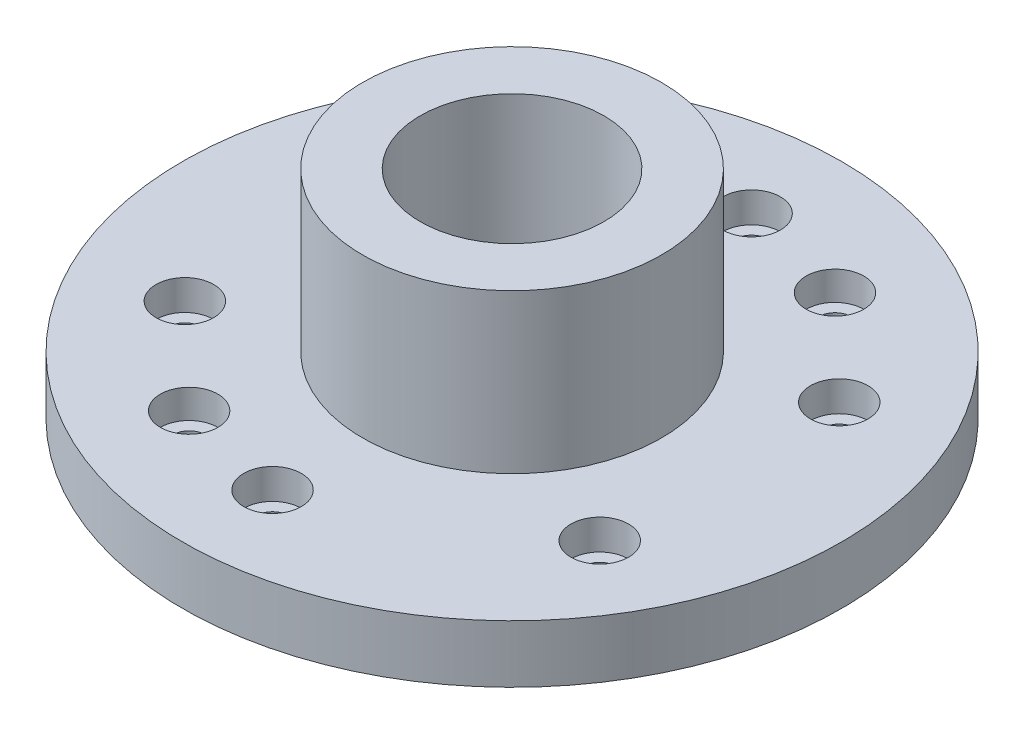
ISO-10303-21;
HEADER;
FILE_DESCRIPTION(('STEP AP214'),'2;1');
FILE_NAME('part.step','',(''),(''),'','','');
FILE_SCHEMA(('AUTOMOTIVE_DESIGN { 1 0 10303 214 1 1 1 1 }'));
ENDSEC;
DATA;
#1=APPLICATION_CONTEXT('core data for automotive mechanical design processes');
#2=APPLICATION_PROTOCOL_DEFINITION('international standard','automotive_design',2000,#1);
#3=PRODUCT_CONTEXT('',#1,'mechanical');
#4=PRODUCT('Part','Part','',(#3));
#5=PRODUCT_RELATED_PRODUCT_CATEGORY('part','',(#4));
#6=PRODUCT_DEFINITION_FORMATION('','',#4);
#7=PRODUCT_DEFINITION_CONTEXT('part definition',#1,'design');
#8=PRODUCT_DEFINITION('design','',#6,#7);
#9=PRODUCT_DEFINITION_SHAPE('','',#8);
#10=(LENGTH_UNIT() NAMED_UNIT(*) SI_UNIT(.MILLI.,.METRE.));
#11=(NAMED_UNIT(*) PLANE_ANGLE_UNIT() SI_UNIT($,.RADIAN.));
#12=(NAMED_UNIT(*) SI_UNIT($,.STERADIAN.) SOLID_ANGLE_UNIT());
#13=UNCERTAINTY_MEASURE_WITH_UNIT(LENGTH_MEASURE(1.E-05),#10,'distance_accuracy_value','');
#14=(GEOMETRIC_REPRESENTATION_CONTEXT(3) GLOBAL_UNCERTAINTY_ASSIGNED_CONTEXT((#13)) GLOBAL_UNIT_ASSIGNED_CONTEXT((#10,
#11,#12)) REPRESENTATION_CONTEXT('',''));
#15=CARTESIAN_POINT('',(0.,0.,0.));
#16=DIRECTION('',(0.,0.,1.));
#17=DIRECTION('',(1.,0.,0.));
#18=AXIS2_PLACEMENT_3D('',#15,#16,#17);
#19=CARTESIAN_POINT('',(0.,-55.,0.));
#20=DIRECTION('',(0.,-1.,0.));
#21=DIRECTION('',(0.,0.,-1.));
#22=AXIS2_PLACEMENT_3D('',#19,#20,#21);
#23=CYLINDRICAL_SURFACE('',#22,12.75);
#24=CARTESIAN_POINT('',(0.,30.,0.));
#25=DIRECTION('',(0.,-1.,0.));
#26=DIRECTION('',(0.,0.,-1.));
#27=AXIS2_PLACEMENT_3D('',#24,#25,#26);
#28=CIRCLE('',#27,12.75);
#29=CARTESIAN_POINT('',(0.,30.,-12.75));
#30=VERTEX_POINT('',#29);
#31=EDGE_CURVE('E57',#30,#30,#28,.T.);
#32=ORIENTED_EDGE('',*,*,#31,.F.);
#33=EDGE_LOOP('',(#32));
#34=FACE_BOUND('',#33,.T.);
#35=CARTESIAN_POINT('',(0.,0.,0.));
#36=DIRECTION('',(0.,-1.,0.));
#37=DIRECTION('',(0.,0.,-1.));
#38=AXIS2_PLACEMENT_3D('',#35,#36,#37);
#39=CIRCLE('',#38,12.75);
#40=CARTESIAN_POINT('',(0.,0.,-12.75));
#41=VERTEX_POINT('',#40);
#42=EDGE_CURVE('E10',#41,#41,#39,.T.);
#43=ORIENTED_EDGE('',*,*,#42,.T.);
#44=EDGE_LOOP('',(#43));
#45=FACE_BOUND('',#44,.T.);
#46=ADVANCED_FACE('F35',(#34,#45),#23,.F.);
#47=CARTESIAN_POINT('',(0.,0.,12.75));
#48=DIRECTION('',(0.,1.,0.));
#49=DIRECTION('',(0.,0.,1.));
#50=AXIS2_PLACEMENT_3D('',#47,#48,#49);
#51=PLANE('',#50);
#52=CARTESIAN_POINT('',(-15.3131735293869,0.,29.5138817585676));
#53=DIRECTION('',(0.,1.,0.));
#54=DIRECTION('',(0.,0.,1.));
#55=AXIS2_PLACEMENT_3D('',#52,#53,#54);
#56=CIRCLE('',#55,2.25);
#57=CARTESIAN_POINT('',(-15.3131735293869,0.,31.7638817585676));
#58=VERTEX_POINT('',#57);
#59=EDGE_CURVE('E144',#58,#58,#56,.T.);
#60=ORIENTED_EDGE('',*,*,#59,.T.);
#61=EDGE_LOOP('',(#60));
#62=FACE_BOUND('',#61,.T.);
#63=CARTESIAN_POINT('',(15.3131735293943,0.,-29.5138817585697));
#64=DIRECTION('',(0.,1.,0.));
#65=DIRECTION('',(0.,0.,1.));
#66=AXIS2_PLACEMENT_3D('',#63,#64,#65);
#67=CIRCLE('',#66,2.25);
#68=CARTESIAN_POINT('',(15.3131735293943,0.,-27.2638817585697));
#69=VERTEX_POINT('',#68);
#70=EDGE_CURVE('E132',#69,#69,#67,.T.);
#71=ORIENTED_EDGE('',*,*,#70,.T.);
#72=EDGE_LOOP('',(#71));
#73=FACE_BOUND('',#72,.T.);
#74=CARTESIAN_POINT('',(0.,0.,-33.25));
#75=DIRECTION('',(0.,1.,0.));
#76=DIRECTION('',(0.,0.,1.));
#77=AXIS2_PLACEMENT_3D('',#74,#75,#76);
#78=CIRCLE('',#77,2.25);
#79=CARTESIAN_POINT('',(0.,0.,-31.));
#80=VERTEX_POINT('',#79);
#81=EDGE_CURVE('E120',#80,#80,#78,.T.);
#82=ORIENTED_EDGE('',*,*,#81,.T.);
#83=EDGE_LOOP('',(#82));
#84=FACE_BOUND('',#83,.T.);
#85=CARTESIAN_POINT('',(28.7953446758333,0.,-16.6250000000012));
#86=DIRECTION('',(0.,1.,0.));
#87=DIRECTION('',(0.,0.,1.));
#88=AXIS2_PLACEMENT_3D('',#85,#86,#87);
#89=CIRCLE('',#88,2.25);
#90=CARTESIAN_POINT('',(28.7953446758333,0.,-14.3750000000012));
#91=VERTEX_POINT('',#90);
#92=EDGE_CURVE('E108',#91,#91,#89,.T.);
#93=ORIENTED_EDGE('',*,*,#92,.T.);
#94=EDGE_LOOP('',(#93));
#95=FACE_BOUND('',#94,.T.);
#96=CARTESIAN_POINT('',(28.7953446758347,0.,16.6249999999988));
#97=DIRECTION('',(0.,1.,0.));
#98=DIRECTION('',(0.,0.,1.));
#99=AXIS2_PLACEMENT_3D('',#96,#97,#98);
#100=CIRCLE('',#99,2.25);
#101=CARTESIAN_POINT('',(28.7953446758347,0.,18.8749999999988));
#102=VERTEX_POINT('',#101);
#103=EDGE_CURVE('E96',#102,#102,#100,.T.);
#104=ORIENTED_EDGE('',*,*,#103,.T.);
#105=EDGE_LOOP('',(#104));
#106=FACE_BOUND('',#105,.T.);
#107=CARTESIAN_POINT('',(2.82806299161933E-12,0.,33.25));
#108=DIRECTION('',(0.,1.,0.));
#109=DIRECTION('',(0.,0.,1.));
#110=AXIS2_PLACEMENT_3D('',#107,#108,#109);
#111=CIRCLE('',#110,2.25);
#112=CARTESIAN_POINT('',(2.82806299161933E-12,0.,35.5));
#113=VERTEX_POINT('',#112);
#114=EDGE_CURVE('E84',#113,#113,#111,.T.);
#115=ORIENTED_EDGE('',*,*,#114,.T.);
#116=EDGE_LOOP('',(#115));
#117=FACE_BOUND('',#116,.T.);
#118=CARTESIAN_POINT('',(-28.7953446758305,0.,16.6250000000012));
#119=DIRECTION('',(0.,1.,0.));
#120=DIRECTION('',(0.,0.,1.));
#121=AXIS2_PLACEMENT_3D('',#118,#119,#120);
#122=CIRCLE('',#121,2.25);
#123=CARTESIAN_POINT('',(-28.7953446758305,0.,18.8750000000012));
#124=VERTEX_POINT('',#123);
#125=EDGE_CURVE('E72',#124,#124,#122,.T.);
#126=ORIENTED_EDGE('',*,*,#125,.T.);
#127=EDGE_LOOP('',(#126));
#128=FACE_BOUND('',#127,.T.);
#129=CARTESIAN_POINT('',(-28.7953446758319,0.,-16.6249999999988));
#130=DIRECTION('',(0.,1.,0.));
#131=DIRECTION('',(0.,0.,1.));
#132=AXIS2_PLACEMENT_3D('',#129,#130,#131);
#133=CIRCLE('',#132,2.25);
#134=CARTESIAN_POINT('',(-28.7953446758319,0.,-14.3749999999988));
#135=VERTEX_POINT('',#134);
#136=EDGE_CURVE('E60',#135,#135,#133,.T.);
#137=ORIENTED_EDGE('',*,*,#136,.T.);
#138=EDGE_LOOP('',(#137));
#139=FACE_BOUND('',#138,.T.);
#140=ORIENTED_EDGE('',*,*,#42,.F.);
#141=EDGE_LOOP('',(#140));
#142=FACE_BOUND('',#141,.T.);
#143=CARTESIAN_POINT('',(0.,0.,0.));
#144=DIRECTION('',(0.,-1.,0.));
#145=DIRECTION('',(0.,0.,-1.));
#146=AXIS2_PLACEMENT_3D('',#143,#144,#145);
#147=CIRCLE('',#146,45.75);
#148=CARTESIAN_POINT('',(0.,0.,-45.75));
#149=VERTEX_POINT('',#148);
#150=EDGE_CURVE('E41',#149,#149,#147,.T.);
#151=ORIENTED_EDGE('',*,*,#150,.T.);
#152=EDGE_LOOP('',(#151));
#153=FACE_BOUND('',#152,.T.);
#154=ADVANCED_FACE('F196',(#62,#73,#84,#95,#106,#117,#128,#139,#142,#153),#51,.F.);
#155=CARTESIAN_POINT('',(0.,-55.,0.));
#156=DIRECTION('',(0.,-1.,0.));
#157=DIRECTION('',(0.,0.,-1.));
#158=AXIS2_PLACEMENT_3D('',#155,#156,#157);
#159=CYLINDRICAL_SURFACE('',#158,45.75);
#160=ORIENTED_EDGE('',*,*,#150,.F.);
#161=EDGE_LOOP('',(#160));
#162=FACE_BOUND('',#161,.T.);
#163=CARTESIAN_POINT('',(0.,7.99999999999999,0.));
#164=DIRECTION('',(0.,-1.,0.));
#165=DIRECTION('',(0.,0.,-1.));
#166=AXIS2_PLACEMENT_3D('',#163,#164,#165);
#167=CIRCLE('',#166,45.75);
#168=CARTESIAN_POINT('',(0.,7.99999999999999,-45.75));
#169=VERTEX_POINT('',#168);
#170=EDGE_CURVE('E45',#169,#169,#167,.T.);
#171=ORIENTED_EDGE('',*,*,#170,.T.);
#172=EDGE_LOOP('',(#171));
#173=FACE_BOUND('',#172,.T.);
#174=ADVANCED_FACE('F163',(#162,#173),#159,.T.);
#175=CARTESIAN_POINT('',(0.,7.99999999999999,45.75));
#176=DIRECTION('',(0.,-1.,0.));
#177=DIRECTION('',(0.,0.,-1.));
#178=AXIS2_PLACEMENT_3D('',#175,#176,#177);
#179=PLANE('',#178);
#180=CARTESIAN_POINT('',(-15.3131735293869,7.99999999999999,29.5138817585676));
#181=DIRECTION('',(0.,1.,0.));
#182=DIRECTION('',(0.,0.,1.));
#183=AXIS2_PLACEMENT_3D('',#180,#181,#182);
#184=CIRCLE('',#183,4.);
#185=CARTESIAN_POINT('',(-15.3131735293869,7.99999999999999,33.5138817585676));
#186=VERTEX_POINT('',#185);
#187=EDGE_CURVE('E153',#186,#186,#184,.T.);
#188=ORIENTED_EDGE('',*,*,#187,.F.);
#189=EDGE_LOOP('',(#188));
#190=FACE_BOUND('',#189,.T.);
#191=CARTESIAN_POINT('',(15.3131735293943,7.99999999999999,-29.5138817585697));
#192=DIRECTION('',(0.,1.,0.));
#193=DIRECTION('',(0.,0.,1.));
#194=AXIS2_PLACEMENT_3D('',#191,#192,#193);
#195=CIRCLE('',#194,4.);
#196=CARTESIAN_POINT('',(15.3131735293943,7.99999999999999,-25.5138817585697));
#197=VERTEX_POINT('',#196);
#198=EDGE_CURVE('E141',#197,#197,#195,.T.);
#199=ORIENTED_EDGE('',*,*,#198,.F.);
#200=EDGE_LOOP('',(#199));
#201=FACE_BOUND('',#200,.T.);
#202=CARTESIAN_POINT('',(0.,7.99999999999999,-33.25));
#203=DIRECTION('',(0.,1.,0.));
#204=DIRECTION('',(0.,0.,1.));
#205=AXIS2_PLACEMENT_3D('',#202,#203,#204);
#206=CIRCLE('',#205,3.99999999999999);
#207=CARTESIAN_POINT('',(0.,7.99999999999999,-29.25));
#208=VERTEX_POINT('',#207);
#209=EDGE_CURVE('E129',#208,#208,#206,.T.);
#210=ORIENTED_EDGE('',*,*,#209,.F.);
#211=EDGE_LOOP('',(#210));
#212=FACE_BOUND('',#211,.T.);
#213=CARTESIAN_POINT('',(28.7953446758333,7.99999999999999,-16.6250000000012));
#214=DIRECTION('',(0.,1.,0.));
#215=DIRECTION('',(0.,0.,1.));
#216=AXIS2_PLACEMENT_3D('',#213,#214,#215);
#217=CIRCLE('',#216,4.);
#218=CARTESIAN_POINT('',(28.7953446758333,7.99999999999999,-12.6250000000012));
#219=VERTEX_POINT('',#218);
#220=EDGE_CURVE('E117',#219,#219,#217,.T.);
#221=ORIENTED_EDGE('',*,*,#220,.F.);
#222=EDGE_LOOP('',(#221));
#223=FACE_BOUND('',#222,.T.);
#224=CARTESIAN_POINT('',(28.7953446758347,7.99999999999999,16.6249999999988));
#225=DIRECTION('',(0.,1.,0.));
#226=DIRECTION('',(0.,0.,1.));
#227=AXIS2_PLACEMENT_3D('',#224,#225,#226);
#228=CIRCLE('',#227,3.99999999999999);
#229=CARTESIAN_POINT('',(28.7953446758347,7.99999999999999,20.6249999999988));
#230=VERTEX_POINT('',#229);
#231=EDGE_CURVE('E105',#230,#230,#228,.T.);
#232=ORIENTED_EDGE('',*,*,#231,.F.);
#233=EDGE_LOOP('',(#232));
#234=FACE_BOUND('',#233,.T.);
#235=CARTESIAN_POINT('',(2.82806299161933E-12,7.99999999999999,33.25));
#236=DIRECTION('',(0.,1.,0.));
#237=DIRECTION('',(0.,0.,1.));
#238=AXIS2_PLACEMENT_3D('',#235,#236,#237);
#239=CIRCLE('',#238,3.99999999999999);
#240=CARTESIAN_POINT('',(2.82806299161933E-12,7.99999999999999,37.25));
#241=VERTEX_POINT('',#240);
#242=EDGE_CURVE('E93',#241,#241,#239,.T.);
#243=ORIENTED_EDGE('',*,*,#242,.F.);
#244=EDGE_LOOP('',(#243));
#245=FACE_BOUND('',#244,.T.);
#246=CARTESIAN_POINT('',(-28.7953446758305,7.99999999999999,16.6250000000012));
#247=DIRECTION('',(0.,1.,0.));
#248=DIRECTION('',(0.,0.,1.));
#249=AXIS2_PLACEMENT_3D('',#246,#247,#248);
#250=CIRCLE('',#249,3.99999999999999);
#251=CARTESIAN_POINT('',(-28.7953446758305,7.99999999999999,20.6250000000012));
#252=VERTEX_POINT('',#251);
#253=EDGE_CURVE('E81',#252,#252,#250,.T.);
#254=ORIENTED_EDGE('',*,*,#253,.F.);
#255=EDGE_LOOP('',(#254));
#256=FACE_BOUND('',#255,.T.);
#257=CARTESIAN_POINT('',(-28.7953446758319,7.99999999999999,-16.6249999999988));
#258=DIRECTION('',(0.,1.,0.));
#259=DIRECTION('',(0.,0.,1.));
#260=AXIS2_PLACEMENT_3D('',#257,#258,#259);
#261=CIRCLE('',#260,3.99999999999999);
#262=CARTESIAN_POINT('',(-28.7953446758319,7.99999999999999,-12.6249999999988));
#263=VERTEX_POINT('',#262);
#264=EDGE_CURVE('E69',#263,#263,#261,.T.);
#265=ORIENTED_EDGE('',*,*,#264,.F.);
#266=EDGE_LOOP('',(#265));
#267=FACE_BOUND('',#266,.T.);
#268=ORIENTED_EDGE('',*,*,#170,.F.);
#269=EDGE_LOOP('',(#268));
#270=FACE_BOUND('',#269,.T.);
#271=CARTESIAN_POINT('',(0.,7.99999999999999,0.));
#272=DIRECTION('',(0.,-1.,0.));
#273=DIRECTION('',(0.,0.,-1.));
#274=AXIS2_PLACEMENT_3D('',#271,#272,#273);
#275=CIRCLE('',#274,20.75);
#276=CARTESIAN_POINT('',(0.,7.99999999999999,-20.75));
#277=VERTEX_POINT('',#276);
#278=EDGE_CURVE('E49',#277,#277,#275,.T.);
#279=ORIENTED_EDGE('',*,*,#278,.T.);
#280=EDGE_LOOP('',(#279));
#281=FACE_BOUND('',#280,.T.);
#282=ADVANCED_FACE('F159',(#190,#201,#212,#223,#234,#245,#256,#267,#270,#281),#179,.F.);
#283=CARTESIAN_POINT('',(0.,-55.,0.));
#284=DIRECTION('',(0.,-1.,0.));
#285=DIRECTION('',(0.,0.,-1.));
#286=AXIS2_PLACEMENT_3D('',#283,#284,#285);
#287=CYLINDRICAL_SURFACE('',#286,20.75);
#288=ORIENTED_EDGE('',*,*,#278,.F.);
#289=EDGE_LOOP('',(#288));
#290=FACE_BOUND('',#289,.T.);
#291=CARTESIAN_POINT('',(0.,30.,0.));
#292=DIRECTION('',(0.,-1.,0.));
#293=DIRECTION('',(0.,0.,-1.));
#294=AXIS2_PLACEMENT_3D('',#291,#292,#293);
#295=CIRCLE('',#294,20.75);
#296=CARTESIAN_POINT('',(0.,30.,-20.75));
#297=VERTEX_POINT('',#296);
#298=EDGE_CURVE('E54',#297,#297,#295,.T.);
#299=ORIENTED_EDGE('',*,*,#298,.T.);
#300=EDGE_LOOP('',(#299));
#301=FACE_BOUND('',#300,.T.);
#302=ADVANCED_FACE('F162',(#290,#301),#287,.T.);
#303=CARTESIAN_POINT('',(0.,30.,20.75));
#304=DIRECTION('',(0.,-1.,0.));
#305=DIRECTION('',(0.,0.,-1.));
#306=AXIS2_PLACEMENT_3D('',#303,#304,#305);
#307=PLANE('',#306);
#308=ORIENTED_EDGE('',*,*,#298,.F.);
#309=EDGE_LOOP('',(#308));
#310=FACE_BOUND('',#309,.T.);
#311=ORIENTED_EDGE('',*,*,#31,.T.);
#312=EDGE_LOOP('',(#311));
#313=FACE_BOUND('',#312,.T.);
#314=ADVANCED_FACE('F185',(#310,#313),#307,.F.);
#315=CARTESIAN_POINT('',(-28.7953446758319,7.99999999999999,-16.6249999999988));
#316=DIRECTION('',(0.,1.,0.));
#317=DIRECTION('',(0.,0.,1.));
#318=AXIS2_PLACEMENT_3D('',#315,#316,#317);
#319=CYLINDRICAL_SURFACE('',#318,2.25000000000001);
#320=ORIENTED_EDGE('',*,*,#136,.F.);
#321=EDGE_LOOP('',(#320));
#322=FACE_BOUND('',#321,.T.);
#323=CARTESIAN_POINT('',(-28.7953446758319,3.79999999999999,-16.6249999999988));
#324=DIRECTION('',(0.,1.,0.));
#325=DIRECTION('',(0.,0.,1.));
#326=AXIS2_PLACEMENT_3D('',#323,#324,#325);
#327=CIRCLE('',#326,2.25000000000001);
#328=CARTESIAN_POINT('',(-28.7953446758319,3.79999999999999,-14.3749999999988));
#329=VERTEX_POINT('',#328);
#330=EDGE_CURVE('E63',#329,#329,#327,.T.);
#331=ORIENTED_EDGE('',*,*,#330,.T.);
#332=EDGE_LOOP('',(#331));
#333=FACE_BOUND('',#332,.T.);
#334=ADVANCED_FACE('F191',(#322,#333),#319,.F.);
#335=CARTESIAN_POINT('',(-26.5453446758319,3.79999999999999,-16.6249999999988));
#336=DIRECTION('',(0.,-1.,0.));
#337=DIRECTION('',(0.,0.,-1.));
#338=AXIS2_PLACEMENT_3D('',#335,#336,#337);
#339=PLANE('',#338);
#340=ORIENTED_EDGE('',*,*,#330,.F.);
#341=EDGE_LOOP('',(#340));
#342=FACE_BOUND('',#341,.T.);
#343=CARTESIAN_POINT('',(-28.7953446758319,3.79999999999999,-16.6249999999988));
#344=DIRECTION('',(0.,1.,0.));
#345=DIRECTION('',(0.,0.,1.));
#346=AXIS2_PLACEMENT_3D('',#343,#344,#345);
#347=CIRCLE('',#346,3.99999999999999);
#348=CARTESIAN_POINT('',(-28.7953446758319,3.79999999999999,-12.6249999999988));
#349=VERTEX_POINT('',#348);
#350=EDGE_CURVE('E66',#349,#349,#347,.T.);
#351=ORIENTED_EDGE('',*,*,#350,.T.);
#352=EDGE_LOOP('',(#351));
#353=FACE_BOUND('',#352,.T.);
#354=ADVANCED_FACE('F210',(#342,#353),#339,.F.);
#355=CARTESIAN_POINT('',(-28.7953446758319,7.99999999999999,-16.6249999999988));
#356=DIRECTION('',(0.,1.,0.));
#357=DIRECTION('',(0.,0.,1.));
#358=AXIS2_PLACEMENT_3D('',#355,#356,#357);
#359=CYLINDRICAL_SURFACE('',#358,3.99999999999999);
#360=ORIENTED_EDGE('',*,*,#350,.F.);
#361=EDGE_LOOP('',(#360));
#362=FACE_BOUND('',#361,.T.);
#363=ORIENTED_EDGE('',*,*,#264,.T.);
#364=EDGE_LOOP('',(#363));
#365=FACE_BOUND('',#364,.T.);
#366=ADVANCED_FACE('F214',(#362,#365),#359,.F.);
#367=CARTESIAN_POINT('',(-28.7953446758305,7.99999999999999,16.6250000000012));
#368=DIRECTION('',(0.,1.,0.));
#369=DIRECTION('',(0.,0.,1.));
#370=AXIS2_PLACEMENT_3D('',#367,#368,#369);
#371=CYLINDRICAL_SURFACE('',#370,2.25000000000001);
#372=ORIENTED_EDGE('',*,*,#125,.F.);
#373=EDGE_LOOP('',(#372));
#374=FACE_BOUND('',#373,.T.);
#375=CARTESIAN_POINT('',(-28.7953446758305,3.79999999999999,16.6250000000012));
#376=DIRECTION('',(0.,1.,0.));
#377=DIRECTION('',(0.,0.,1.));
#378=AXIS2_PLACEMENT_3D('',#375,#376,#377);
#379=CIRCLE('',#378,2.25000000000001);
#380=CARTESIAN_POINT('',(-28.7953446758305,3.79999999999999,18.8750000000012));
#381=VERTEX_POINT('',#380);
#382=EDGE_CURVE('E75',#381,#381,#379,.T.);
#383=ORIENTED_EDGE('',*,*,#382,.T.);
#384=EDGE_LOOP('',(#383));
#385=FACE_BOUND('',#384,.T.);
#386=ADVANCED_FACE('F218',(#374,#385),#371,.F.);
#387=CARTESIAN_POINT('',(-26.5453446758304,3.79999999999999,16.6250000000012));
#388=DIRECTION('',(0.,-1.,0.));
#389=DIRECTION('',(0.,0.,-1.));
#390=AXIS2_PLACEMENT_3D('',#387,#388,#389);
#391=PLANE('',#390);
#392=ORIENTED_EDGE('',*,*,#382,.F.);
#393=EDGE_LOOP('',(#392));
#394=FACE_BOUND('',#393,.T.);
#395=CARTESIAN_POINT('',(-28.7953446758305,3.79999999999999,16.6250000000012));
#396=DIRECTION('',(0.,1.,0.));
#397=DIRECTION('',(0.,0.,1.));
#398=AXIS2_PLACEMENT_3D('',#395,#396,#397);
#399=CIRCLE('',#398,3.99999999999999);
#400=CARTESIAN_POINT('',(-28.7953446758305,3.79999999999999,20.6250000000012));
#401=VERTEX_POINT('',#400);
#402=EDGE_CURVE('E78',#401,#401,#399,.T.);
#403=ORIENTED_EDGE('',*,*,#402,.T.);
#404=EDGE_LOOP('',(#403));
#405=FACE_BOUND('',#404,.T.);
#406=ADVANCED_FACE('F222',(#394,#405),#391,.F.);
#407=CARTESIAN_POINT('',(-28.7953446758305,7.99999999999999,16.6250000000012));
#408=DIRECTION('',(0.,1.,0.));
#409=DIRECTION('',(0.,0.,1.));
#410=AXIS2_PLACEMENT_3D('',#407,#408,#409);
#411=CYLINDRICAL_SURFACE('',#410,3.99999999999999);
#412=ORIENTED_EDGE('',*,*,#402,.F.);
#413=EDGE_LOOP('',(#412));
#414=FACE_BOUND('',#413,.T.);
#415=ORIENTED_EDGE('',*,*,#253,.T.);
#416=EDGE_LOOP('',(#415));
#417=FACE_BOUND('',#416,.T.);
#418=ADVANCED_FACE('F226',(#414,#417),#411,.F.);
#419=CARTESIAN_POINT('',(2.82806299161933E-12,7.99999999999999,33.25));
#420=DIRECTION('',(0.,1.,0.));
#421=DIRECTION('',(0.,0.,1.));
#422=AXIS2_PLACEMENT_3D('',#419,#420,#421);
#423=CYLINDRICAL_SURFACE('',#422,2.25000000000001);
#424=ORIENTED_EDGE('',*,*,#114,.F.);
#425=EDGE_LOOP('',(#424));
#426=FACE_BOUND('',#425,.T.);
#427=CARTESIAN_POINT('',(2.82806299161933E-12,3.79999999999999,33.25));
#428=DIRECTION('',(0.,1.,0.));
#429=DIRECTION('',(0.,0.,1.));
#430=AXIS2_PLACEMENT_3D('',#427,#428,#429);
#431=CIRCLE('',#430,2.25000000000001);
#432=CARTESIAN_POINT('',(2.82806299161933E-12,3.79999999999999,35.5));
#433=VERTEX_POINT('',#432);
#434=EDGE_CURVE('E87',#433,#433,#431,.T.);
#435=ORIENTED_EDGE('',*,*,#434,.T.);
#436=EDGE_LOOP('',(#435));
#437=FACE_BOUND('',#436,.T.);
#438=ADVANCED_FACE('F230',(#426,#437),#423,.F.);
#439=CARTESIAN_POINT('',(2.25000000000284,3.79999999999999,33.25));
#440=DIRECTION('',(0.,-1.,0.));
#441=DIRECTION('',(0.,0.,-1.));
#442=AXIS2_PLACEMENT_3D('',#439,#440,#441);
#443=PLANE('',#442);
#444=ORIENTED_EDGE('',*,*,#434,.F.);
#445=EDGE_LOOP('',(#444));
#446=FACE_BOUND('',#445,.T.);
#447=CARTESIAN_POINT('',(2.82806299161933E-12,3.79999999999999,33.25));
#448=DIRECTION('',(0.,1.,0.));
#449=DIRECTION('',(0.,0.,1.));
#450=AXIS2_PLACEMENT_3D('',#447,#448,#449);
#451=CIRCLE('',#450,3.99999999999999);
#452=CARTESIAN_POINT('',(2.82806299161933E-12,3.79999999999999,37.25));
#453=VERTEX_POINT('',#452);
#454=EDGE_CURVE('E90',#453,#453,#451,.T.);
#455=ORIENTED_EDGE('',*,*,#454,.T.);
#456=EDGE_LOOP('',(#455));
#457=FACE_BOUND('',#456,.T.);
#458=ADVANCED_FACE('F234',(#446,#457),#443,.F.);
#459=CARTESIAN_POINT('',(2.82806299161933E-12,7.99999999999999,33.25));
#460=DIRECTION('',(0.,1.,0.));
#461=DIRECTION('',(0.,0.,1.));
#462=AXIS2_PLACEMENT_3D('',#459,#460,#461);
#463=CYLINDRICAL_SURFACE('',#462,3.99999999999999);
#464=ORIENTED_EDGE('',*,*,#454,.F.);
#465=EDGE_LOOP('',(#464));
#466=FACE_BOUND('',#465,.T.);
#467=ORIENTED_EDGE('',*,*,#242,.T.);
#468=EDGE_LOOP('',(#467));
#469=FACE_BOUND('',#468,.T.);
#470=ADVANCED_FACE('F238',(#466,#469),#463,.F.);
#471=CARTESIAN_POINT('',(28.7953446758347,7.99999999999999,16.6249999999988));
#472=DIRECTION('',(0.,1.,0.));
#473=DIRECTION('',(0.,0.,1.));
#474=AXIS2_PLACEMENT_3D('',#471,#472,#473);
#475=CYLINDRICAL_SURFACE('',#474,2.25000000000001);
#476=ORIENTED_EDGE('',*,*,#103,.F.);
#477=EDGE_LOOP('',(#476));
#478=FACE_BOUND('',#477,.T.);
#479=CARTESIAN_POINT('',(28.7953446758347,3.79999999999999,16.6249999999988));
#480=DIRECTION('',(0.,1.,0.));
#481=DIRECTION('',(0.,0.,1.));
#482=AXIS2_PLACEMENT_3D('',#479,#480,#481);
#483=CIRCLE('',#482,2.25000000000001);
#484=CARTESIAN_POINT('',(28.7953446758347,3.79999999999999,18.8749999999988));
#485=VERTEX_POINT('',#484);
#486=EDGE_CURVE('E99',#485,#485,#483,.T.);
#487=ORIENTED_EDGE('',*,*,#486,.T.);
#488=EDGE_LOOP('',(#487));
#489=FACE_BOUND('',#488,.T.);
#490=ADVANCED_FACE('F242',(#478,#489),#475,.F.);
#491=CARTESIAN_POINT('',(31.0453446758347,3.79999999999999,16.6249999999988));
#492=DIRECTION('',(0.,-1.,0.));
#493=DIRECTION('',(0.,0.,-1.));
#494=AXIS2_PLACEMENT_3D('',#491,#492,#493);
#495=PLANE('',#494);
#496=ORIENTED_EDGE('',*,*,#486,.F.);
#497=EDGE_LOOP('',(#496));
#498=FACE_BOUND('',#497,.T.);
#499=CARTESIAN_POINT('',(28.7953446758347,3.79999999999999,16.6249999999988));
#500=DIRECTION('',(0.,1.,0.));
#501=DIRECTION('',(0.,0.,1.));
#502=AXIS2_PLACEMENT_3D('',#499,#500,#501);
#503=CIRCLE('',#502,3.99999999999999);
#504=CARTESIAN_POINT('',(28.7953446758347,3.79999999999999,20.6249999999988));
#505=VERTEX_POINT('',#504);
#506=EDGE_CURVE('E102',#505,#505,#503,.T.);
#507=ORIENTED_EDGE('',*,*,#506,.T.);
#508=EDGE_LOOP('',(#507));
#509=FACE_BOUND('',#508,.T.);
#510=ADVANCED_FACE('F246',(#498,#509),#495,.F.);
#511=CARTESIAN_POINT('',(28.7953446758347,7.99999999999999,16.6249999999988));
#512=DIRECTION('',(0.,1.,0.));
#513=DIRECTION('',(0.,0.,1.));
#514=AXIS2_PLACEMENT_3D('',#511,#512,#513);
#515=CYLINDRICAL_SURFACE('',#514,3.99999999999999);
#516=ORIENTED_EDGE('',*,*,#506,.F.);
#517=EDGE_LOOP('',(#516));
#518=FACE_BOUND('',#517,.T.);
#519=ORIENTED_EDGE('',*,*,#231,.T.);
#520=EDGE_LOOP('',(#519));
#521=FACE_BOUND('',#520,.T.);
#522=ADVANCED_FACE('F250',(#518,#521),#515,.F.);
#523=CARTESIAN_POINT('',(28.7953446758333,7.99999999999999,-16.6250000000012));
#524=DIRECTION('',(0.,1.,0.));
#525=DIRECTION('',(0.,0.,1.));
#526=AXIS2_PLACEMENT_3D('',#523,#524,#525);
#527=CYLINDRICAL_SURFACE('',#526,2.25000000000001);
#528=ORIENTED_EDGE('',*,*,#92,.F.);
#529=EDGE_LOOP('',(#528));
#530=FACE_BOUND('',#529,.T.);
#531=CARTESIAN_POINT('',(28.7953446758333,3.79999999999999,-16.6250000000012));
#532=DIRECTION('',(0.,1.,0.));
#533=DIRECTION('',(0.,0.,1.));
#534=AXIS2_PLACEMENT_3D('',#531,#532,#533);
#535=CIRCLE('',#534,2.25000000000001);
#536=CARTESIAN_POINT('',(28.7953446758333,3.79999999999999,-14.3750000000012));
#537=VERTEX_POINT('',#536);
#538=EDGE_CURVE('E111',#537,#537,#535,.T.);
#539=ORIENTED_EDGE('',*,*,#538,.T.);
#540=EDGE_LOOP('',(#539));
#541=FACE_BOUND('',#540,.T.);
#542=ADVANCED_FACE('F254',(#530,#541),#527,.F.);
#543=CARTESIAN_POINT('',(31.0453446758333,3.79999999999999,-16.6250000000012));
#544=DIRECTION('',(0.,-1.,0.));
#545=DIRECTION('',(0.,0.,-1.));
#546=AXIS2_PLACEMENT_3D('',#543,#544,#545);
#547=PLANE('',#546);
#548=ORIENTED_EDGE('',*,*,#538,.F.);
#549=EDGE_LOOP('',(#548));
#550=FACE_BOUND('',#549,.T.);
#551=CARTESIAN_POINT('',(28.7953446758333,3.79999999999999,-16.6250000000012));
#552=DIRECTION('',(0.,1.,0.));
#553=DIRECTION('',(0.,0.,1.));
#554=AXIS2_PLACEMENT_3D('',#551,#552,#553);
#555=CIRCLE('',#554,4.);
#556=CARTESIAN_POINT('',(28.7953446758333,3.79999999999999,-12.6250000000012));
#557=VERTEX_POINT('',#556);
#558=EDGE_CURVE('E114',#557,#557,#555,.T.);
#559=ORIENTED_EDGE('',*,*,#558,.T.);
#560=EDGE_LOOP('',(#559));
#561=FACE_BOUND('',#560,.T.);
#562=ADVANCED_FACE('F258',(#550,#561),#547,.F.);
#563=CARTESIAN_POINT('',(28.7953446758333,7.99999999999999,-16.6250000000012));
#564=DIRECTION('',(0.,1.,0.));
#565=DIRECTION('',(0.,0.,1.));
#566=AXIS2_PLACEMENT_3D('',#563,#564,#565);
#567=CYLINDRICAL_SURFACE('',#566,4.);
#568=ORIENTED_EDGE('',*,*,#558,.F.);
#569=EDGE_LOOP('',(#568));
#570=FACE_BOUND('',#569,.T.);
#571=ORIENTED_EDGE('',*,*,#220,.T.);
#572=EDGE_LOOP('',(#571));
#573=FACE_BOUND('',#572,.T.);
#574=ADVANCED_FACE('F262',(#570,#573),#567,.F.);
#575=CARTESIAN_POINT('',(0.,7.99999999999999,-33.25));
#576=DIRECTION('',(0.,1.,0.));
#577=DIRECTION('',(0.,0.,1.));
#578=AXIS2_PLACEMENT_3D('',#575,#576,#577);
#579=CYLINDRICAL_SURFACE('',#578,2.25000000000001);
#580=ORIENTED_EDGE('',*,*,#81,.F.);
#581=EDGE_LOOP('',(#580));
#582=FACE_BOUND('',#581,.T.);
#583=CARTESIAN_POINT('',(0.,3.79999999999999,-33.25));
#584=DIRECTION('',(0.,1.,0.));
#585=DIRECTION('',(0.,0.,1.));
#586=AXIS2_PLACEMENT_3D('',#583,#584,#585);
#587=CIRCLE('',#586,2.25000000000001);
#588=CARTESIAN_POINT('',(0.,3.79999999999999,-31.));
#589=VERTEX_POINT('',#588);
#590=EDGE_CURVE('E123',#589,#589,#587,.T.);
#591=ORIENTED_EDGE('',*,*,#590,.T.);
#592=EDGE_LOOP('',(#591));
#593=FACE_BOUND('',#592,.T.);
#594=ADVANCED_FACE('F266',(#582,#593),#579,.F.);
#595=CARTESIAN_POINT('',(2.25000000000001,3.79999999999999,-33.25));
#596=DIRECTION('',(0.,-1.,0.));
#597=DIRECTION('',(0.,0.,-1.));
#598=AXIS2_PLACEMENT_3D('',#595,#596,#597);
#599=PLANE('',#598);
#600=ORIENTED_EDGE('',*,*,#590,.F.);
#601=EDGE_LOOP('',(#600));
#602=FACE_BOUND('',#601,.T.);
#603=CARTESIAN_POINT('',(0.,3.79999999999999,-33.25));
#604=DIRECTION('',(0.,1.,0.));
#605=DIRECTION('',(0.,0.,1.));
#606=AXIS2_PLACEMENT_3D('',#603,#604,#605);
#607=CIRCLE('',#606,3.99999999999999);
#608=CARTESIAN_POINT('',(0.,3.79999999999999,-29.25));
#609=VERTEX_POINT('',#608);
#610=EDGE_CURVE('E126',#609,#609,#607,.T.);
#611=ORIENTED_EDGE('',*,*,#610,.T.);
#612=EDGE_LOOP('',(#611));
#613=FACE_BOUND('',#612,.T.);
#614=ADVANCED_FACE('F270',(#602,#613),#599,.F.);
#615=CARTESIAN_POINT('',(0.,7.99999999999999,-33.25));
#616=DIRECTION('',(0.,1.,0.));
#617=DIRECTION('',(0.,0.,1.));
#618=AXIS2_PLACEMENT_3D('',#615,#616,#617);
#619=CYLINDRICAL_SURFACE('',#618,3.99999999999999);
#620=ORIENTED_EDGE('',*,*,#610,.F.);
#621=EDGE_LOOP('',(#620));
#622=FACE_BOUND('',#621,.T.);
#623=ORIENTED_EDGE('',*,*,#209,.T.);
#624=EDGE_LOOP('',(#623));
#625=FACE_BOUND('',#624,.T.);
#626=ADVANCED_FACE('F274',(#622,#625),#619,.F.);
#627=CARTESIAN_POINT('',(15.3131735293943,7.99999999999999,-29.5138817585697));
#628=DIRECTION('',(0.,1.,0.));
#629=DIRECTION('',(0.,0.,1.));
#630=AXIS2_PLACEMENT_3D('',#627,#628,#629);
#631=CYLINDRICAL_SURFACE('',#630,2.25);
#632=ORIENTED_EDGE('',*,*,#70,.F.);
#633=EDGE_LOOP('',(#632));
#634=FACE_BOUND('',#633,.T.);
#635=CARTESIAN_POINT('',(15.3131735293943,3.99999999999999,-29.5138817585697));
#636=DIRECTION('',(0.,1.,0.));
#637=DIRECTION('',(0.,0.,1.));
#638=AXIS2_PLACEMENT_3D('',#635,#636,#637);
#639=CIRCLE('',#638,2.25);
#640=CARTESIAN_POINT('',(15.3131735293943,3.99999999999999,-27.2638817585697));
#641=VERTEX_POINT('',#640);
#642=EDGE_CURVE('E135',#641,#641,#639,.T.);
#643=ORIENTED_EDGE('',*,*,#642,.T.);
#644=EDGE_LOOP('',(#643));
#645=FACE_BOUND('',#644,.T.);
#646=ADVANCED_FACE('F278',(#634,#645),#631,.F.);
#647=CARTESIAN_POINT('',(17.5631735293943,3.99999999999999,-29.5138817585697));
#648=DIRECTION('',(0.,-1.,0.));
#649=DIRECTION('',(0.,0.,-1.));
#650=AXIS2_PLACEMENT_3D('',#647,#648,#649);
#651=PLANE('',#650);
#652=ORIENTED_EDGE('',*,*,#642,.F.);
#653=EDGE_LOOP('',(#652));
#654=FACE_BOUND('',#653,.T.);
#655=CARTESIAN_POINT('',(15.3131735293943,3.99999999999999,-29.5138817585697));
#656=DIRECTION('',(0.,1.,0.));
#657=DIRECTION('',(0.,0.,1.));
#658=AXIS2_PLACEMENT_3D('',#655,#656,#657);
#659=CIRCLE('',#658,4.);
#660=CARTESIAN_POINT('',(15.3131735293943,3.99999999999999,-25.5138817585697));
#661=VERTEX_POINT('',#660);
#662=EDGE_CURVE('E138',#661,#661,#659,.T.);
#663=ORIENTED_EDGE('',*,*,#662,.T.);
#664=EDGE_LOOP('',(#663));
#665=FACE_BOUND('',#664,.T.);
#666=ADVANCED_FACE('F282',(#654,#665),#651,.F.);
#667=CARTESIAN_POINT('',(15.3131735293943,7.99999999999999,-29.5138817585697));
#668=DIRECTION('',(0.,1.,0.));
#669=DIRECTION('',(0.,0.,1.));
#670=AXIS2_PLACEMENT_3D('',#667,#668,#669);
#671=CYLINDRICAL_SURFACE('',#670,4.);
#672=ORIENTED_EDGE('',*,*,#662,.F.);
#673=EDGE_LOOP('',(#672));
#674=FACE_BOUND('',#673,.T.);
#675=ORIENTED_EDGE('',*,*,#198,.T.);
#676=EDGE_LOOP('',(#675));
#677=FACE_BOUND('',#676,.T.);
#678=ADVANCED_FACE('F286',(#674,#677),#671,.F.);
#679=CARTESIAN_POINT('',(-15.3131735293869,7.99999999999999,29.5138817585676));
#680=DIRECTION('',(0.,1.,0.));
#681=DIRECTION('',(0.,0.,1.));
#682=AXIS2_PLACEMENT_3D('',#679,#680,#681);
#683=CYLINDRICAL_SURFACE('',#682,2.25);
#684=ORIENTED_EDGE('',*,*,#59,.F.);
#685=EDGE_LOOP('',(#684));
#686=FACE_BOUND('',#685,.T.);
#687=CARTESIAN_POINT('',(-15.3131735293869,3.99999999999999,29.5138817585676));
#688=DIRECTION('',(0.,1.,0.));
#689=DIRECTION('',(0.,0.,1.));
#690=AXIS2_PLACEMENT_3D('',#687,#688,#689);
#691=CIRCLE('',#690,2.25);
#692=CARTESIAN_POINT('',(-15.3131735293869,3.99999999999999,31.7638817585676));
#693=VERTEX_POINT('',#692);
#694=EDGE_CURVE('E147',#693,#693,#691,.T.);
#695=ORIENTED_EDGE('',*,*,#694,.T.);
#696=EDGE_LOOP('',(#695));
#697=FACE_BOUND('',#696,.T.);
#698=ADVANCED_FACE('F290',(#686,#697),#683,.F.);
#699=CARTESIAN_POINT('',(-13.0631735293869,3.99999999999999,29.5138817585676));
#700=DIRECTION('',(0.,-1.,0.));
#701=DIRECTION('',(0.,0.,-1.));
#702=AXIS2_PLACEMENT_3D('',#699,#700,#701);
#703=PLANE('',#702);
#704=ORIENTED_EDGE('',*,*,#694,.F.);
#705=EDGE_LOOP('',(#704));
#706=FACE_BOUND('',#705,.T.);
#707=CARTESIAN_POINT('',(-15.3131735293869,3.99999999999999,29.5138817585676));
#708=DIRECTION('',(0.,1.,0.));
#709=DIRECTION('',(0.,0.,1.));
#710=AXIS2_PLACEMENT_3D('',#707,#708,#709);
#711=CIRCLE('',#710,4.);
#712=CARTESIAN_POINT('',(-15.3131735293869,3.99999999999999,33.5138817585676));
#713=VERTEX_POINT('',#712);
#714=EDGE_CURVE('E150',#713,#713,#711,.T.);
#715=ORIENTED_EDGE('',*,*,#714,.T.);
#716=EDGE_LOOP('',(#715));
#717=FACE_BOUND('',#716,.T.);
#718=ADVANCED_FACE('F294',(#706,#717),#703,.F.);
#719=CARTESIAN_POINT('',(-15.3131735293869,7.99999999999999,29.5138817585676));
#720=DIRECTION('',(0.,1.,0.));
#721=DIRECTION('',(0.,0.,1.));
#722=AXIS2_PLACEMENT_3D('',#719,#720,#721);
#723=CYLINDRICAL_SURFACE('',#722,4.);
#724=ORIENTED_EDGE('',*,*,#714,.F.);
#725=EDGE_LOOP('',(#724));
#726=FACE_BOUND('',#725,.T.);
#727=ORIENTED_EDGE('',*,*,#187,.T.);
#728=EDGE_LOOP('',(#727));
#729=FACE_BOUND('',#728,.T.);
#730=ADVANCED_FACE('F157',(#726,#729),#723,.F.);
#731=CLOSED_SHELL('',(#46,#154,#174,#282,#302,#314,#334,#354,#366,#386,#406,#418,#438,#458,#470,
#490,#510,#522,#542,#562,#574,#594,#614,#626,#646,#666,#678,#698,#718,#730));
#732=MANIFOLD_SOLID_BREP('B2',#731);
#733=ADVANCED_BREP_SHAPE_REPRESENTATION('',(#18,#732),#14);
#734=SHAPE_DEFINITION_REPRESENTATION(#9,#733);
ENDSEC;
END-ISO-10303-21;
